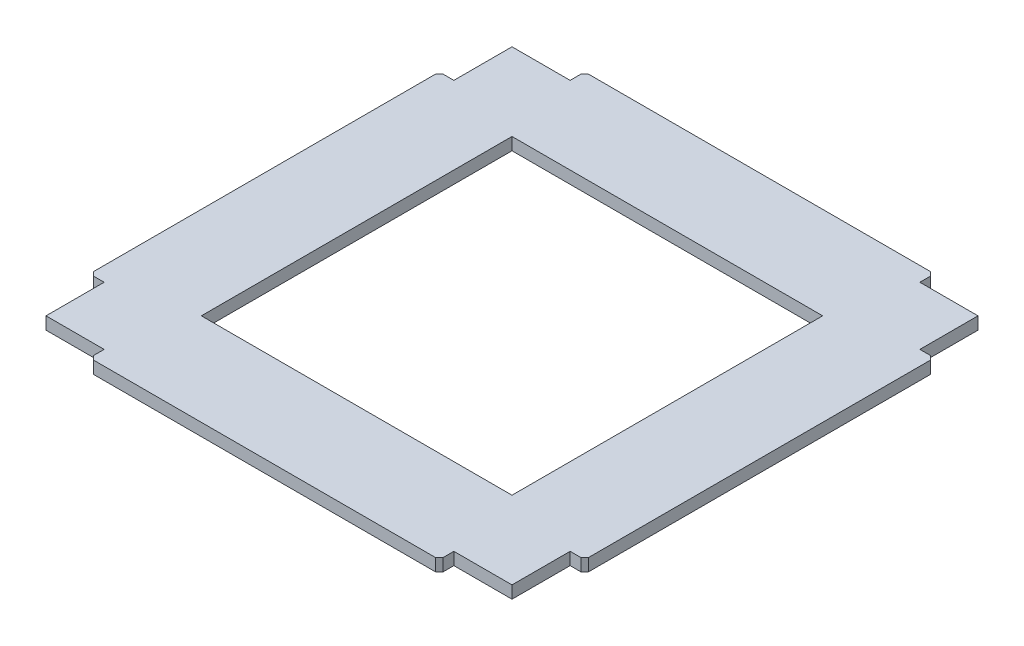
ISO-10303-21;
HEADER;
FILE_DESCRIPTION(('STEP AP214'),'2;1');
FILE_NAME('part.step','',(''),(''),'','','');
FILE_SCHEMA(('AUTOMOTIVE_DESIGN { 1 0 10303 214 1 1 1 1 }'));
ENDSEC;
DATA;
#1=APPLICATION_CONTEXT('core data for automotive mechanical design processes');
#2=APPLICATION_PROTOCOL_DEFINITION('international standard','automotive_design',2000,#1);
#3=PRODUCT_CONTEXT('',#1,'mechanical');
#4=PRODUCT('Part','Part','',(#3));
#5=PRODUCT_RELATED_PRODUCT_CATEGORY('part','',(#4));
#6=PRODUCT_DEFINITION_FORMATION('','',#4);
#7=PRODUCT_DEFINITION_CONTEXT('part definition',#1,'design');
#8=PRODUCT_DEFINITION('design','',#6,#7);
#9=PRODUCT_DEFINITION_SHAPE('','',#8);
#10=(LENGTH_UNIT() NAMED_UNIT(*) SI_UNIT(.MILLI.,.METRE.));
#11=(NAMED_UNIT(*) PLANE_ANGLE_UNIT() SI_UNIT($,.RADIAN.));
#12=(NAMED_UNIT(*) SI_UNIT($,.STERADIAN.) SOLID_ANGLE_UNIT());
#13=UNCERTAINTY_MEASURE_WITH_UNIT(LENGTH_MEASURE(1.E-05),#10,'distance_accuracy_value','');
#14=(GEOMETRIC_REPRESENTATION_CONTEXT(3) GLOBAL_UNCERTAINTY_ASSIGNED_CONTEXT((#13)) GLOBAL_UNIT_ASSIGNED_CONTEXT((#10,
#11,#12)) REPRESENTATION_CONTEXT('',''));
#15=CARTESIAN_POINT('',(0.,0.,0.));
#16=DIRECTION('',(0.,0.,1.));
#17=DIRECTION('',(1.,0.,0.));
#18=AXIS2_PLACEMENT_3D('',#15,#16,#17);
#19=CARTESIAN_POINT('',(0.,4.064,0.));
#20=DIRECTION('',(0.,-1.,0.));
#21=DIRECTION('',(0.,0.,-1.));
#22=AXIS2_PLACEMENT_3D('',#19,#20,#21);
#23=PLANE('',#22);
#24=DIRECTION('',(0.,0.,-1.));
#25=VECTOR('',#24,1.);
#26=CARTESIAN_POINT('',(757.555,4.064,57.1849999999999));
#27=LINE('',#26,#25);
#28=CARTESIAN_POINT('',(757.555,4.064,55.935));
#29=VERTEX_POINT('',#28);
#30=CARTESIAN_POINT('',(757.555,4.064,-55.9349999999995));
#31=VERTEX_POINT('',#30);
#32=EDGE_CURVE('E296',#29,#31,#27,.T.);
#33=ORIENTED_EDGE('',*,*,#32,.T.);
#34=DIRECTION('',(0.707106781186563,0.,0.707106781186532));
#35=VECTOR('',#34,1.);
#36=CARTESIAN_POINT('',(756.305,4.064,-57.1849999999994));
#37=LINE('',#36,#35);
#38=CARTESIAN_POINT('',(756.305,4.064,-57.1849999999994));
#39=VERTEX_POINT('',#38);
#40=EDGE_CURVE('E455',#31,#39,#37,.F.);
#41=ORIENTED_EDGE('',*,*,#40,.T.);
#42=DIRECTION('',(-1.,0.,0.));
#43=VECTOR('',#42,1.);
#44=CARTESIAN_POINT('',(757.555,4.064,-57.1849999999994));
#45=LINE('',#44,#43);
#46=CARTESIAN_POINT('',(752.7925,4.064,-57.1849999999994));
#47=VERTEX_POINT('',#46);
#48=EDGE_CURVE('E299',#39,#47,#45,.T.);
#49=ORIENTED_EDGE('',*,*,#48,.T.);
#50=DIRECTION('',(0.,0.,-1.));
#51=VECTOR('',#50,1.);
#52=CARTESIAN_POINT('',(752.7925,4.064,-76.2));
#53=LINE('',#52,#51);
#54=CARTESIAN_POINT('',(752.7925,4.064,-76.2));
#55=VERTEX_POINT('',#54);
#56=EDGE_CURVE('E301',#47,#55,#53,.T.);
#57=ORIENTED_EDGE('',*,*,#56,.T.);
#58=DIRECTION('',(-1.,0.,0.));
#59=VECTOR('',#58,1.);
#60=CARTESIAN_POINT('',(733.7775,4.064,-76.2));
#61=LINE('',#60,#59);
#62=CARTESIAN_POINT('',(733.7775,4.064,-76.2));
#63=VERTEX_POINT('',#62);
#64=EDGE_CURVE('E303',#55,#63,#61,.T.);
#65=ORIENTED_EDGE('',*,*,#64,.T.);
#66=DIRECTION('',(0.,0.,-1.));
#67=VECTOR('',#66,1.);
#68=CARTESIAN_POINT('',(733.7775,4.064,-80.9625));
#69=LINE('',#68,#67);
#70=CARTESIAN_POINT('',(733.7775,4.064,-79.7125000000001));
#71=VERTEX_POINT('',#70);
#72=EDGE_CURVE('E305',#63,#71,#69,.T.);
#73=ORIENTED_EDGE('',*,*,#72,.T.);
#74=DIRECTION('',(0.707106781186563,0.,0.707106781186532));
#75=VECTOR('',#74,1.);
#76=CARTESIAN_POINT('',(732.5275,4.064,-80.9625));
#77=LINE('',#76,#75);
#78=CARTESIAN_POINT('',(732.5275,4.064,-80.9625));
#79=VERTEX_POINT('',#78);
#80=EDGE_CURVE('E446',#71,#79,#77,.F.);
#81=ORIENTED_EDGE('',*,*,#80,.T.);
#82=DIRECTION('',(-1.,0.,0.));
#83=VECTOR('',#82,1.);
#84=CARTESIAN_POINT('',(619.4075,4.064,-80.9625));
#85=LINE('',#84,#83);
#86=CARTESIAN_POINT('',(620.6575,4.064,-80.9625));
#87=VERTEX_POINT('',#86);
#88=EDGE_CURVE('E308',#79,#87,#85,.T.);
#89=ORIENTED_EDGE('',*,*,#88,.T.);
#90=DIRECTION('',(0.707106781186563,0.,-0.707106781186532));
#91=VECTOR('',#90,1.);
#92=CARTESIAN_POINT('',(619.4075,4.064,-79.7125000000001));
#93=LINE('',#92,#91);
#94=CARTESIAN_POINT('',(619.4075,4.064,-79.7125000000001));
#95=VERTEX_POINT('',#94);
#96=EDGE_CURVE('E442',#87,#95,#93,.F.);
#97=ORIENTED_EDGE('',*,*,#96,.T.);
#98=DIRECTION('',(0.,0.,1.));
#99=VECTOR('',#98,1.);
#100=CARTESIAN_POINT('',(619.4075,4.064,-80.9625));
#101=LINE('',#100,#99);
#102=CARTESIAN_POINT('',(619.4075,4.064,-76.2));
#103=VERTEX_POINT('',#102);
#104=EDGE_CURVE('E311',#95,#103,#101,.T.);
#105=ORIENTED_EDGE('',*,*,#104,.T.);
#106=DIRECTION('',(-1.,0.,0.));
#107=VECTOR('',#106,1.);
#108=CARTESIAN_POINT('',(600.3925,4.064,-76.2));
#109=LINE('',#108,#107);
#110=CARTESIAN_POINT('',(600.3925,4.064,-76.2));
#111=VERTEX_POINT('',#110);
#112=EDGE_CURVE('E313',#103,#111,#109,.T.);
#113=ORIENTED_EDGE('',*,*,#112,.T.);
#114=DIRECTION('',(0.,0.,1.));
#115=VECTOR('',#114,1.);
#116=CARTESIAN_POINT('',(600.3925,4.064,-57.1849999999997));
#117=LINE('',#116,#115);
#118=CARTESIAN_POINT('',(600.3925,4.064,-57.1849999999997));
#119=VERTEX_POINT('',#118);
#120=EDGE_CURVE('E315',#111,#119,#117,.T.);
#121=ORIENTED_EDGE('',*,*,#120,.T.);
#122=DIRECTION('',(-1.,0.,0.));
#123=VECTOR('',#122,1.);
#124=CARTESIAN_POINT('',(595.63,4.064,-57.1849999999997));
#125=LINE('',#124,#123);
#126=CARTESIAN_POINT('',(596.88,4.064,-57.1849999999997));
#127=VERTEX_POINT('',#126);
#128=EDGE_CURVE('E317',#119,#127,#125,.T.);
#129=ORIENTED_EDGE('',*,*,#128,.T.);
#130=DIRECTION('',(0.707106781186548,0.,-0.707106781186548));
#131=VECTOR('',#130,1.);
#132=CARTESIAN_POINT('',(595.63,4.064,-55.9349999999998));
#133=LINE('',#132,#131);
#134=CARTESIAN_POINT('',(595.63,4.064,-55.9349999999998));
#135=VERTEX_POINT('',#134);
#136=EDGE_CURVE('E444',#127,#135,#133,.F.);
#137=ORIENTED_EDGE('',*,*,#136,.T.);
#138=DIRECTION('',(0.,0.,1.));
#139=VECTOR('',#138,1.);
#140=CARTESIAN_POINT('',(595.63,4.064,-57.1849999999997));
#141=LINE('',#140,#139);
#142=CARTESIAN_POINT('',(595.63,4.064,55.9349999999996));
#143=VERTEX_POINT('',#142);
#144=EDGE_CURVE('E320',#135,#143,#141,.T.);
#145=ORIENTED_EDGE('',*,*,#144,.T.);
#146=DIRECTION('',(-0.707106781186548,0.,-0.707106781186548));
#147=VECTOR('',#146,1.);
#148=CARTESIAN_POINT('',(596.88,4.064,57.1849999999996));
#149=LINE('',#148,#147);
#150=CARTESIAN_POINT('',(596.88,4.064,57.1849999999996));
#151=VERTEX_POINT('',#150);
#152=EDGE_CURVE('E448',#143,#151,#149,.F.);
#153=ORIENTED_EDGE('',*,*,#152,.T.);
#154=DIRECTION('',(1.,0.,0.));
#155=VECTOR('',#154,1.);
#156=CARTESIAN_POINT('',(595.63,4.064,57.1849999999996));
#157=LINE('',#156,#155);
#158=CARTESIAN_POINT('',(600.3925,4.064,57.1849999999996));
#159=VERTEX_POINT('',#158);
#160=EDGE_CURVE('E323',#151,#159,#157,.T.);
#161=ORIENTED_EDGE('',*,*,#160,.T.);
#162=DIRECTION('',(0.,0.,1.));
#163=VECTOR('',#162,1.);
#164=CARTESIAN_POINT('',(600.3925,4.064,76.2));
#165=LINE('',#164,#163);
#166=CARTESIAN_POINT('',(600.3925,4.064,76.2));
#167=VERTEX_POINT('',#166);
#168=EDGE_CURVE('E325',#159,#167,#165,.T.);
#169=ORIENTED_EDGE('',*,*,#168,.T.);
#170=DIRECTION('',(1.,0.,0.));
#171=VECTOR('',#170,1.);
#172=CARTESIAN_POINT('',(619.4075,4.064,76.2));
#173=LINE('',#172,#171);
#174=CARTESIAN_POINT('',(619.4075,4.064,76.2));
#175=VERTEX_POINT('',#174);
#176=EDGE_CURVE('E327',#167,#175,#173,.T.);
#177=ORIENTED_EDGE('',*,*,#176,.T.);
#178=DIRECTION('',(0.,0.,1.));
#179=VECTOR('',#178,1.);
#180=CARTESIAN_POINT('',(619.4075,4.064,80.9625));
#181=LINE('',#180,#179);
#182=CARTESIAN_POINT('',(619.4075,4.064,79.7125000000001));
#183=VERTEX_POINT('',#182);
#184=EDGE_CURVE('E329',#175,#183,#181,.T.);
#185=ORIENTED_EDGE('',*,*,#184,.T.);
#186=DIRECTION('',(-0.707106781186548,0.,-0.707106781186548));
#187=VECTOR('',#186,1.);
#188=CARTESIAN_POINT('',(620.6575,4.064,80.9625));
#189=LINE('',#188,#187);
#190=CARTESIAN_POINT('',(620.6575,4.064,80.9625));
#191=VERTEX_POINT('',#190);
#192=EDGE_CURVE('E450',#183,#191,#189,.F.);
#193=ORIENTED_EDGE('',*,*,#192,.T.);
#194=DIRECTION('',(1.,0.,0.));
#195=VECTOR('',#194,1.);
#196=CARTESIAN_POINT('',(619.4075,4.064,80.9625));
#197=LINE('',#196,#195);
#198=CARTESIAN_POINT('',(732.5275,4.064,80.9625));
#199=VERTEX_POINT('',#198);
#200=EDGE_CURVE('E332',#191,#199,#197,.T.);
#201=ORIENTED_EDGE('',*,*,#200,.T.);
#202=DIRECTION('',(-0.707106781186563,0.,0.707106781186532));
#203=VECTOR('',#202,1.);
#204=CARTESIAN_POINT('',(733.7775,4.064,79.7125000000001));
#205=LINE('',#204,#203);
#206=CARTESIAN_POINT('',(733.7775,4.064,79.7125000000001));
#207=VERTEX_POINT('',#206);
#208=EDGE_CURVE('E49',#199,#207,#205,.F.);
#209=ORIENTED_EDGE('',*,*,#208,.T.);
#210=DIRECTION('',(0.,0.,-1.));
#211=VECTOR('',#210,1.);
#212=CARTESIAN_POINT('',(733.7775,4.064,80.9625));
#213=LINE('',#212,#211);
#214=CARTESIAN_POINT('',(733.7775,4.064,76.2));
#215=VERTEX_POINT('',#214);
#216=EDGE_CURVE('E334',#207,#215,#213,.T.);
#217=ORIENTED_EDGE('',*,*,#216,.T.);
#218=DIRECTION('',(1.,0.,0.));
#219=VECTOR('',#218,1.);
#220=CARTESIAN_POINT('',(752.7925,4.064,76.2));
#221=LINE('',#220,#219);
#222=CARTESIAN_POINT('',(752.7925,4.064,76.2));
#223=VERTEX_POINT('',#222);
#224=EDGE_CURVE('E287',#215,#223,#221,.T.);
#225=ORIENTED_EDGE('',*,*,#224,.T.);
#226=DIRECTION('',(0.,0.,-1.));
#227=VECTOR('',#226,1.);
#228=CARTESIAN_POINT('',(752.7925,4.064,57.1849999999999));
#229=LINE('',#228,#227);
#230=CARTESIAN_POINT('',(752.7925,4.064,57.1849999999999));
#231=VERTEX_POINT('',#230);
#232=EDGE_CURVE('E290',#223,#231,#229,.T.);
#233=ORIENTED_EDGE('',*,*,#232,.T.);
#234=DIRECTION('',(1.,0.,0.));
#235=VECTOR('',#234,1.);
#236=CARTESIAN_POINT('',(757.555,4.064,57.1849999999999));
#237=LINE('',#236,#235);
#238=CARTESIAN_POINT('',(756.305,4.064,57.1849999999999));
#239=VERTEX_POINT('',#238);
#240=EDGE_CURVE('E293',#231,#239,#237,.T.);
#241=ORIENTED_EDGE('',*,*,#240,.T.);
#242=DIRECTION('',(-0.707106781186555,0.,0.70710678118654));
#243=VECTOR('',#242,1.);
#244=CARTESIAN_POINT('',(757.555,4.064,55.935));
#245=LINE('',#244,#243);
#246=EDGE_CURVE('E453',#239,#29,#245,.F.);
#247=ORIENTED_EDGE('',*,*,#246,.T.);
#248=EDGE_LOOP('',(#33,#41,#49,#57,#65,#73,#81,#89,#97,#105,#113,#121,#129,#137,#145,#153,#161,
#169,#177,#185,#193,#201,#209,#217,#225,#233,#241,#247));
#249=FACE_BOUND('',#248,.T.);
#250=DIRECTION('',(0.,0.,1.));
#251=VECTOR('',#250,1.);
#252=CARTESIAN_POINT('',(625.7925,4.064,-50.7999999999999));
#253=LINE('',#252,#251);
#254=CARTESIAN_POINT('',(625.7925,4.064,-50.7999999999999));
#255=VERTEX_POINT('',#254);
#256=CARTESIAN_POINT('',(625.7925,4.064,50.8000000000001));
#257=VERTEX_POINT('',#256);
#258=EDGE_CURVE('E246',#255,#257,#253,.T.);
#259=ORIENTED_EDGE('',*,*,#258,.F.);
#260=DIRECTION('',(-1.,0.,0.));
#261=VECTOR('',#260,1.);
#262=CARTESIAN_POINT('',(727.3925,4.064,-50.7999999999999));
#263=LINE('',#262,#261);
#264=CARTESIAN_POINT('',(727.3925,4.064,-50.7999999999999));
#265=VERTEX_POINT('',#264);
#266=EDGE_CURVE('E271',#265,#255,#263,.T.);
#267=ORIENTED_EDGE('',*,*,#266,.F.);
#268=DIRECTION('',(0.,0.,-1.));
#269=VECTOR('',#268,1.);
#270=CARTESIAN_POINT('',(727.3925,4.064,-50.7999999999999));
#271=LINE('',#270,#269);
#272=CARTESIAN_POINT('',(727.3925,4.064,50.8000000000001));
#273=VERTEX_POINT('',#272);
#274=EDGE_CURVE('E269',#273,#265,#271,.T.);
#275=ORIENTED_EDGE('',*,*,#274,.F.);
#276=DIRECTION('',(1.,0.,0.));
#277=VECTOR('',#276,1.);
#278=CARTESIAN_POINT('',(727.3925,4.064,50.8000000000001));
#279=LINE('',#278,#277);
#280=EDGE_CURVE('E256',#257,#273,#279,.T.);
#281=ORIENTED_EDGE('',*,*,#280,.F.);
#282=EDGE_LOOP('',(#259,#267,#275,#281));
#283=FACE_BOUND('',#282,.T.);
#284=ADVANCED_FACE('F34',(#249,#283),#23,.F.);
#285=CARTESIAN_POINT('',(0.,0.,0.));
#286=DIRECTION('',(0.,-1.,0.));
#287=DIRECTION('',(0.,0.,-1.));
#288=AXIS2_PLACEMENT_3D('',#285,#286,#287);
#289=PLANE('',#288);
#290=DIRECTION('',(-1.,0.,0.));
#291=VECTOR('',#290,1.);
#292=CARTESIAN_POINT('',(757.555,0.,-57.1849999999994));
#293=LINE('',#292,#291);
#294=CARTESIAN_POINT('',(756.305,0.,-57.1849999999994));
#295=VERTEX_POINT('',#294);
#296=CARTESIAN_POINT('',(752.7925,0.,-57.1849999999994));
#297=VERTEX_POINT('',#296);
#298=EDGE_CURVE('E347',#295,#297,#293,.T.);
#299=ORIENTED_EDGE('',*,*,#298,.F.);
#300=DIRECTION('',(-0.707106781186563,0.,-0.707106781186532));
#301=VECTOR('',#300,1.);
#302=CARTESIAN_POINT('',(406.744999999983,0.,-406.745000000001));
#303=LINE('',#302,#301);
#304=CARTESIAN_POINT('',(757.555,0.,-55.9349999999995));
#305=VERTEX_POINT('',#304);
#306=EDGE_CURVE('E435',#295,#305,#303,.F.);
#307=ORIENTED_EDGE('',*,*,#306,.T.);
#308=DIRECTION('',(0.,0.,-1.));
#309=VECTOR('',#308,1.);
#310=CARTESIAN_POINT('',(757.555,0.,57.1849999999999));
#311=LINE('',#310,#309);
#312=CARTESIAN_POINT('',(757.555,0.,55.935));
#313=VERTEX_POINT('',#312);
#314=EDGE_CURVE('E344',#313,#305,#311,.T.);
#315=ORIENTED_EDGE('',*,*,#314,.F.);
#316=DIRECTION('',(0.707106781186555,0.,-0.70710678118654));
#317=VECTOR('',#316,1.);
#318=CARTESIAN_POINT('',(406.744999999992,0.,406.745000000001));
#319=LINE('',#318,#317);
#320=CARTESIAN_POINT('',(756.305,0.,57.1849999999999));
#321=VERTEX_POINT('',#320);
#322=EDGE_CURVE('E433',#313,#321,#319,.F.);
#323=ORIENTED_EDGE('',*,*,#322,.T.);
#324=DIRECTION('',(1.,0.,0.));
#325=VECTOR('',#324,1.);
#326=CARTESIAN_POINT('',(757.555,0.,57.1849999999999));
#327=LINE('',#326,#325);
#328=CARTESIAN_POINT('',(752.7925,0.,57.1849999999999));
#329=VERTEX_POINT('',#328);
#330=EDGE_CURVE('E341',#329,#321,#327,.T.);
#331=ORIENTED_EDGE('',*,*,#330,.F.);
#332=DIRECTION('',(0.,0.,-1.));
#333=VECTOR('',#332,1.);
#334=CARTESIAN_POINT('',(752.7925,0.,57.1849999999999));
#335=LINE('',#334,#333);
#336=CARTESIAN_POINT('',(752.7925,0.,76.2));
#337=VERTEX_POINT('',#336);
#338=EDGE_CURVE('E339',#337,#329,#335,.T.);
#339=ORIENTED_EDGE('',*,*,#338,.F.);
#340=DIRECTION('',(1.,0.,0.));
#341=VECTOR('',#340,1.);
#342=CARTESIAN_POINT('',(752.7925,0.,76.2));
#343=LINE('',#342,#341);
#344=CARTESIAN_POINT('',(733.7775,0.,76.2));
#345=VERTEX_POINT('',#344);
#346=EDGE_CURVE('E264',#345,#337,#343,.T.);
#347=ORIENTED_EDGE('',*,*,#346,.F.);
#348=DIRECTION('',(0.,0.,-1.));
#349=VECTOR('',#348,1.);
#350=CARTESIAN_POINT('',(733.7775,0.,80.9625));
#351=LINE('',#350,#349);
#352=CARTESIAN_POINT('',(733.7775,0.,79.7125000000001));
#353=VERTEX_POINT('',#352);
#354=EDGE_CURVE('E291',#353,#345,#351,.T.);
#355=ORIENTED_EDGE('',*,*,#354,.F.);
#356=DIRECTION('',(0.707106781186563,0.,-0.707106781186532));
#357=VECTOR('',#356,1.);
#358=CARTESIAN_POINT('',(406.744999999984,0.,406.745000000002));
#359=LINE('',#358,#357);
#360=CARTESIAN_POINT('',(732.5275,0.,80.9625));
#361=VERTEX_POINT('',#360);
#362=EDGE_CURVE('E431',#353,#361,#359,.F.);
#363=ORIENTED_EDGE('',*,*,#362,.T.);
#364=DIRECTION('',(1.,0.,0.));
#365=VECTOR('',#364,1.);
#366=CARTESIAN_POINT('',(619.4075,0.,80.9625));
#367=LINE('',#366,#365);
#368=CARTESIAN_POINT('',(620.6575,0.,80.9625));
#369=VERTEX_POINT('',#368);
#370=EDGE_CURVE('E380',#369,#361,#367,.T.);
#371=ORIENTED_EDGE('',*,*,#370,.F.);
#372=DIRECTION('',(0.707106781186548,0.,0.707106781186548));
#373=VECTOR('',#372,1.);
#374=CARTESIAN_POINT('',(269.8475,0.,-269.8475));
#375=LINE('',#374,#373);
#376=CARTESIAN_POINT('',(619.4075,0.,79.7125000000001));
#377=VERTEX_POINT('',#376);
#378=EDGE_CURVE('E429',#369,#377,#375,.F.);
#379=ORIENTED_EDGE('',*,*,#378,.T.);
#380=DIRECTION('',(0.,0.,1.));
#381=VECTOR('',#380,1.);
#382=CARTESIAN_POINT('',(619.4075,0.,80.9625));
#383=LINE('',#382,#381);
#384=CARTESIAN_POINT('',(619.4075,0.,76.2));
#385=VERTEX_POINT('',#384);
#386=EDGE_CURVE('E377',#385,#377,#383,.T.);
#387=ORIENTED_EDGE('',*,*,#386,.F.);
#388=DIRECTION('',(1.,0.,0.));
#389=VECTOR('',#388,1.);
#390=CARTESIAN_POINT('',(619.4075,0.,76.2));
#391=LINE('',#390,#389);
#392=CARTESIAN_POINT('',(600.3925,0.,76.2));
#393=VERTEX_POINT('',#392);
#394=EDGE_CURVE('E375',#393,#385,#391,.T.);
#395=ORIENTED_EDGE('',*,*,#394,.F.);
#396=DIRECTION('',(0.,0.,1.));
#397=VECTOR('',#396,1.);
#398=CARTESIAN_POINT('',(600.3925,0.,76.2));
#399=LINE('',#398,#397);
#400=CARTESIAN_POINT('',(600.3925,0.,57.1849999999996));
#401=VERTEX_POINT('',#400);
#402=EDGE_CURVE('E373',#401,#393,#399,.T.);
#403=ORIENTED_EDGE('',*,*,#402,.F.);
#404=DIRECTION('',(1.,0.,0.));
#405=VECTOR('',#404,1.);
#406=CARTESIAN_POINT('',(595.63,0.,57.1849999999996));
#407=LINE('',#406,#405);
#408=CARTESIAN_POINT('',(596.88,0.,57.1849999999996));
#409=VERTEX_POINT('',#408);
#410=EDGE_CURVE('E371',#409,#401,#407,.T.);
#411=ORIENTED_EDGE('',*,*,#410,.F.);
#412=DIRECTION('',(0.707106781186548,0.,0.707106781186548));
#413=VECTOR('',#412,1.);
#414=CARTESIAN_POINT('',(269.8475,0.,-269.8475));
#415=LINE('',#414,#413);
#416=CARTESIAN_POINT('',(595.63,0.,55.9349999999996));
#417=VERTEX_POINT('',#416);
#418=EDGE_CURVE('E427',#409,#417,#415,.F.);
#419=ORIENTED_EDGE('',*,*,#418,.T.);
#420=DIRECTION('',(0.,0.,1.));
#421=VECTOR('',#420,1.);
#422=CARTESIAN_POINT('',(595.63,0.,-57.1849999999997));
#423=LINE('',#422,#421);
#424=CARTESIAN_POINT('',(595.63,0.,-55.9349999999998));
#425=VERTEX_POINT('',#424);
#426=EDGE_CURVE('E368',#425,#417,#423,.T.);
#427=ORIENTED_EDGE('',*,*,#426,.F.);
#428=DIRECTION('',(-0.707106781186548,0.,0.707106781186548));
#429=VECTOR('',#428,1.);
#430=CARTESIAN_POINT('',(269.8475,0.,269.8475));
#431=LINE('',#430,#429);
#432=CARTESIAN_POINT('',(596.88,0.,-57.1849999999997));
#433=VERTEX_POINT('',#432);
#434=EDGE_CURVE('E423',#425,#433,#431,.F.);
#435=ORIENTED_EDGE('',*,*,#434,.T.);
#436=DIRECTION('',(-1.,0.,0.));
#437=VECTOR('',#436,1.);
#438=CARTESIAN_POINT('',(595.63,0.,-57.1849999999997));
#439=LINE('',#438,#437);
#440=CARTESIAN_POINT('',(600.3925,0.,-57.1849999999997));
#441=VERTEX_POINT('',#440);
#442=EDGE_CURVE('E365',#441,#433,#439,.T.);
#443=ORIENTED_EDGE('',*,*,#442,.F.);
#444=DIRECTION('',(0.,0.,1.));
#445=VECTOR('',#444,1.);
#446=CARTESIAN_POINT('',(600.3925,0.,-57.1849999999997));
#447=LINE('',#446,#445);
#448=CARTESIAN_POINT('',(600.3925,0.,-76.2));
#449=VERTEX_POINT('',#448);
#450=EDGE_CURVE('E363',#449,#441,#447,.T.);
#451=ORIENTED_EDGE('',*,*,#450,.F.);
#452=DIRECTION('',(-1.,0.,0.));
#453=VECTOR('',#452,1.);
#454=CARTESIAN_POINT('',(600.3925,0.,-76.2));
#455=LINE('',#454,#453);
#456=CARTESIAN_POINT('',(619.4075,0.,-76.2));
#457=VERTEX_POINT('',#456);
#458=EDGE_CURVE('E361',#457,#449,#455,.T.);
#459=ORIENTED_EDGE('',*,*,#458,.F.);
#460=DIRECTION('',(0.,0.,1.));
#461=VECTOR('',#460,1.);
#462=CARTESIAN_POINT('',(619.4075,0.,-80.9625));
#463=LINE('',#462,#461);
#464=CARTESIAN_POINT('',(619.4075,0.,-79.7125000000001));
#465=VERTEX_POINT('',#464);
#466=EDGE_CURVE('E359',#465,#457,#463,.T.);
#467=ORIENTED_EDGE('',*,*,#466,.F.);
#468=DIRECTION('',(-0.707106781186563,0.,0.707106781186532));
#469=VECTOR('',#468,1.);
#470=CARTESIAN_POINT('',(269.847499999986,0.,269.847499999998));
#471=LINE('',#470,#469);
#472=CARTESIAN_POINT('',(620.6575,0.,-80.9625));
#473=VERTEX_POINT('',#472);
#474=EDGE_CURVE('E421',#465,#473,#471,.F.);
#475=ORIENTED_EDGE('',*,*,#474,.T.);
#476=DIRECTION('',(-1.,0.,0.));
#477=VECTOR('',#476,1.);
#478=CARTESIAN_POINT('',(619.4075,0.,-80.9625));
#479=LINE('',#478,#477);
#480=CARTESIAN_POINT('',(732.5275,0.,-80.9625));
#481=VERTEX_POINT('',#480);
#482=EDGE_CURVE('E356',#481,#473,#479,.T.);
#483=ORIENTED_EDGE('',*,*,#482,.F.);
#484=DIRECTION('',(-0.707106781186563,0.,-0.707106781186532));
#485=VECTOR('',#484,1.);
#486=CARTESIAN_POINT('',(406.744999999984,0.,-406.745000000002));
#487=LINE('',#486,#485);
#488=CARTESIAN_POINT('',(733.7775,0.,-79.7125000000001));
#489=VERTEX_POINT('',#488);
#490=EDGE_CURVE('E425',#481,#489,#487,.F.);
#491=ORIENTED_EDGE('',*,*,#490,.T.);
#492=DIRECTION('',(0.,0.,-1.));
#493=VECTOR('',#492,1.);
#494=CARTESIAN_POINT('',(733.7775,0.,-80.9625));
#495=LINE('',#494,#493);
#496=CARTESIAN_POINT('',(733.7775,0.,-76.2));
#497=VERTEX_POINT('',#496);
#498=EDGE_CURVE('E353',#497,#489,#495,.T.);
#499=ORIENTED_EDGE('',*,*,#498,.F.);
#500=DIRECTION('',(-1.,0.,0.));
#501=VECTOR('',#500,1.);
#502=CARTESIAN_POINT('',(733.7775,0.,-76.2));
#503=LINE('',#502,#501);
#504=CARTESIAN_POINT('',(752.7925,0.,-76.2));
#505=VERTEX_POINT('',#504);
#506=EDGE_CURVE('E351',#505,#497,#503,.T.);
#507=ORIENTED_EDGE('',*,*,#506,.F.);
#508=DIRECTION('',(0.,0.,-1.));
#509=VECTOR('',#508,1.);
#510=CARTESIAN_POINT('',(752.7925,0.,-76.2));
#511=LINE('',#510,#509);
#512=EDGE_CURVE('E349',#297,#505,#511,.T.);
#513=ORIENTED_EDGE('',*,*,#512,.F.);
#514=EDGE_LOOP('',(#299,#307,#315,#323,#331,#339,#347,#355,#363,#371,#379,#387,#395,#403,#411,
#419,#427,#435,#443,#451,#459,#467,#475,#483,#491,#499,#507,#513));
#515=FACE_BOUND('',#514,.T.);
#516=DIRECTION('',(-1.,0.,0.));
#517=VECTOR('',#516,1.);
#518=CARTESIAN_POINT('',(727.3925,0.,-50.7999999999999));
#519=LINE('',#518,#517);
#520=CARTESIAN_POINT('',(727.3925,0.,-50.7999999999999));
#521=VERTEX_POINT('',#520);
#522=CARTESIAN_POINT('',(625.7925,0.,-50.7999999999999));
#523=VERTEX_POINT('',#522);
#524=EDGE_CURVE('E257',#521,#523,#519,.T.);
#525=ORIENTED_EDGE('',*,*,#524,.T.);
#526=DIRECTION('',(0.,0.,1.));
#527=VECTOR('',#526,1.);
#528=CARTESIAN_POINT('',(625.7925,0.,-50.7999999999999));
#529=LINE('',#528,#527);
#530=CARTESIAN_POINT('',(625.7925,0.,50.8000000000001));
#531=VERTEX_POINT('',#530);
#532=EDGE_CURVE('E275',#523,#531,#529,.T.);
#533=ORIENTED_EDGE('',*,*,#532,.T.);
#534=DIRECTION('',(1.,0.,0.));
#535=VECTOR('',#534,1.);
#536=CARTESIAN_POINT('',(727.3925,0.,50.8000000000001));
#537=LINE('',#536,#535);
#538=CARTESIAN_POINT('',(727.3925,0.,50.8000000000001));
#539=VERTEX_POINT('',#538);
#540=EDGE_CURVE('E263',#531,#539,#537,.T.);
#541=ORIENTED_EDGE('',*,*,#540,.T.);
#542=DIRECTION('',(0.,0.,-1.));
#543=VECTOR('',#542,1.);
#544=CARTESIAN_POINT('',(727.3925,0.,-50.7999999999999));
#545=LINE('',#544,#543);
#546=EDGE_CURVE('E278',#539,#521,#545,.T.);
#547=ORIENTED_EDGE('',*,*,#546,.T.);
#548=EDGE_LOOP('',(#525,#533,#541,#547));
#549=FACE_BOUND('',#548,.T.);
#550=ADVANCED_FACE('F500',(#515,#549),#289,.T.);
#551=CARTESIAN_POINT('',(752.7925,4.064,76.2));
#552=DIRECTION('',(0.,0.,-1.));
#553=DIRECTION('',(-1.,0.,0.));
#554=AXIS2_PLACEMENT_3D('',#551,#552,#553);
#555=PLANE('',#554);
#556=ORIENTED_EDGE('',*,*,#346,.T.);
#557=DIRECTION('',(0.,-1.,0.));
#558=VECTOR('',#557,1.);
#559=CARTESIAN_POINT('',(752.7925,4.064,76.2));
#560=LINE('',#559,#558);
#561=EDGE_CURVE('E415',#223,#337,#560,.T.);
#562=ORIENTED_EDGE('',*,*,#561,.F.);
#563=ORIENTED_EDGE('',*,*,#224,.F.);
#564=DIRECTION('',(0.,-1.,0.));
#565=VECTOR('',#564,1.);
#566=CARTESIAN_POINT('',(733.7775,4.064,76.2));
#567=LINE('',#566,#565);
#568=EDGE_CURVE('E336',#215,#345,#567,.T.);
#569=ORIENTED_EDGE('',*,*,#568,.T.);
#570=EDGE_LOOP('',(#556,#562,#563,#569));
#571=FACE_BOUND('',#570,.T.);
#572=ADVANCED_FACE('F544',(#571),#555,.F.);
#573=CARTESIAN_POINT('',(752.7925,4.064,57.1849999999999));
#574=DIRECTION('',(-1.,0.,0.));
#575=DIRECTION('',(0.,0.,1.));
#576=AXIS2_PLACEMENT_3D('',#573,#574,#575);
#577=PLANE('',#576);
#578=ORIENTED_EDGE('',*,*,#338,.T.);
#579=DIRECTION('',(0.,-1.,0.));
#580=VECTOR('',#579,1.);
#581=CARTESIAN_POINT('',(752.7925,4.064,57.1849999999999));
#582=LINE('',#581,#580);
#583=EDGE_CURVE('E412',#231,#329,#582,.T.);
#584=ORIENTED_EDGE('',*,*,#583,.F.);
#585=ORIENTED_EDGE('',*,*,#232,.F.);
#586=ORIENTED_EDGE('',*,*,#561,.T.);
#587=EDGE_LOOP('',(#578,#584,#585,#586));
#588=FACE_BOUND('',#587,.T.);
#589=ADVANCED_FACE('F546',(#588),#577,.F.);
#590=CARTESIAN_POINT('',(757.555,4.064,57.1849999999999));
#591=DIRECTION('',(0.,0.,-1.));
#592=DIRECTION('',(-1.,0.,0.));
#593=AXIS2_PLACEMENT_3D('',#590,#591,#592);
#594=PLANE('',#593);
#595=ORIENTED_EDGE('',*,*,#330,.T.);
#596=DIRECTION('',(0.,1.,0.));
#597=VECTOR('',#596,1.);
#598=CARTESIAN_POINT('',(756.305,4.064,57.1849999999999));
#599=LINE('',#598,#597);
#600=EDGE_CURVE('E457',#321,#239,#599,.T.);
#601=ORIENTED_EDGE('',*,*,#600,.T.);
#602=ORIENTED_EDGE('',*,*,#240,.F.);
#603=ORIENTED_EDGE('',*,*,#583,.T.);
#604=EDGE_LOOP('',(#595,#601,#602,#603));
#605=FACE_BOUND('',#604,.T.);
#606=ADVANCED_FACE('F550',(#605),#594,.F.);
#607=CARTESIAN_POINT('',(757.555,4.064,57.1849999999999));
#608=DIRECTION('',(-1.,0.,0.));
#609=DIRECTION('',(0.,0.,1.));
#610=AXIS2_PLACEMENT_3D('',#607,#608,#609);
#611=PLANE('',#610);
#612=ORIENTED_EDGE('',*,*,#314,.T.);
#613=DIRECTION('',(0.,1.,0.));
#614=VECTOR('',#613,1.);
#615=CARTESIAN_POINT('',(757.555,4.064,-55.9349999999995));
#616=LINE('',#615,#614);
#617=EDGE_CURVE('E440',#305,#31,#616,.T.);
#618=ORIENTED_EDGE('',*,*,#617,.T.);
#619=ORIENTED_EDGE('',*,*,#32,.F.);
#620=DIRECTION('',(0.,-1.,0.));
#621=VECTOR('',#620,1.);
#622=CARTESIAN_POINT('',(757.555,4.064,55.935));
#623=LINE('',#622,#621);
#624=EDGE_CURVE('E437',#29,#313,#623,.T.);
#625=ORIENTED_EDGE('',*,*,#624,.T.);
#626=EDGE_LOOP('',(#612,#618,#619,#625));
#627=FACE_BOUND('',#626,.T.);
#628=ADVANCED_FACE('F559',(#627),#611,.F.);
#629=CARTESIAN_POINT('',(757.555,4.064,-57.1849999999994));
#630=DIRECTION('',(0.,0.,1.));
#631=DIRECTION('',(1.,0.,0.));
#632=AXIS2_PLACEMENT_3D('',#629,#630,#631);
#633=PLANE('',#632);
#634=ORIENTED_EDGE('',*,*,#48,.F.);
#635=DIRECTION('',(0.,-1.,0.));
#636=VECTOR('',#635,1.);
#637=CARTESIAN_POINT('',(756.305,4.064,-57.1849999999994));
#638=LINE('',#637,#636);
#639=EDGE_CURVE('E418',#39,#295,#638,.T.);
#640=ORIENTED_EDGE('',*,*,#639,.T.);
#641=ORIENTED_EDGE('',*,*,#298,.T.);
#642=DIRECTION('',(0.,-1.,0.));
#643=VECTOR('',#642,1.);
#644=CARTESIAN_POINT('',(752.7925,4.064,-57.1849999999994));
#645=LINE('',#644,#643);
#646=EDGE_CURVE('E409',#47,#297,#645,.T.);
#647=ORIENTED_EDGE('',*,*,#646,.F.);
#648=EDGE_LOOP('',(#634,#640,#641,#647));
#649=FACE_BOUND('',#648,.T.);
#650=ADVANCED_FACE('F568',(#649),#633,.F.);
#651=CARTESIAN_POINT('',(752.7925,4.064,-76.2));
#652=DIRECTION('',(-1.,0.,0.));
#653=DIRECTION('',(0.,0.,1.));
#654=AXIS2_PLACEMENT_3D('',#651,#652,#653);
#655=PLANE('',#654);
#656=ORIENTED_EDGE('',*,*,#512,.T.);
#657=DIRECTION('',(0.,-1.,0.));
#658=VECTOR('',#657,1.);
#659=CARTESIAN_POINT('',(752.7925,4.064,-76.2));
#660=LINE('',#659,#658);
#661=EDGE_CURVE('E406',#55,#505,#660,.T.);
#662=ORIENTED_EDGE('',*,*,#661,.F.);
#663=ORIENTED_EDGE('',*,*,#56,.F.);
#664=ORIENTED_EDGE('',*,*,#646,.T.);
#665=EDGE_LOOP('',(#656,#662,#663,#664));
#666=FACE_BOUND('',#665,.T.);
#667=ADVANCED_FACE('F575',(#666),#655,.F.);
#668=CARTESIAN_POINT('',(733.7775,4.064,-76.2));
#669=DIRECTION('',(0.,0.,1.));
#670=DIRECTION('',(1.,0.,0.));
#671=AXIS2_PLACEMENT_3D('',#668,#669,#670);
#672=PLANE('',#671);
#673=ORIENTED_EDGE('',*,*,#506,.T.);
#674=DIRECTION('',(0.,-1.,0.));
#675=VECTOR('',#674,1.);
#676=CARTESIAN_POINT('',(733.7775,4.064,-76.2));
#677=LINE('',#676,#675);
#678=EDGE_CURVE('E403',#63,#497,#677,.T.);
#679=ORIENTED_EDGE('',*,*,#678,.F.);
#680=ORIENTED_EDGE('',*,*,#64,.F.);
#681=ORIENTED_EDGE('',*,*,#661,.T.);
#682=EDGE_LOOP('',(#673,#679,#680,#681));
#683=FACE_BOUND('',#682,.T.);
#684=ADVANCED_FACE('F578',(#683),#672,.F.);
#685=CARTESIAN_POINT('',(733.7775,4.064,-80.9625));
#686=DIRECTION('',(-1.,0.,0.));
#687=DIRECTION('',(0.,0.,1.));
#688=AXIS2_PLACEMENT_3D('',#685,#686,#687);
#689=PLANE('',#688);
#690=ORIENTED_EDGE('',*,*,#498,.T.);
#691=DIRECTION('',(0.,1.,0.));
#692=VECTOR('',#691,1.);
#693=CARTESIAN_POINT('',(733.7775,4.064,-79.7125000000001));
#694=LINE('',#693,#692);
#695=EDGE_CURVE('E481',#489,#71,#694,.T.);
#696=ORIENTED_EDGE('',*,*,#695,.T.);
#697=ORIENTED_EDGE('',*,*,#72,.F.);
#698=ORIENTED_EDGE('',*,*,#678,.T.);
#699=EDGE_LOOP('',(#690,#696,#697,#698));
#700=FACE_BOUND('',#699,.T.);
#701=ADVANCED_FACE('F582',(#700),#689,.F.);
#702=CARTESIAN_POINT('',(619.4075,4.064,-80.9625));
#703=DIRECTION('',(0.,0.,1.));
#704=DIRECTION('',(1.,0.,0.));
#705=AXIS2_PLACEMENT_3D('',#702,#703,#704);
#706=PLANE('',#705);
#707=ORIENTED_EDGE('',*,*,#88,.F.);
#708=DIRECTION('',(0.,-1.,0.));
#709=VECTOR('',#708,1.);
#710=CARTESIAN_POINT('',(732.5275,4.064,-80.9625));
#711=LINE('',#710,#709);
#712=EDGE_CURVE('E478',#79,#481,#711,.T.);
#713=ORIENTED_EDGE('',*,*,#712,.T.);
#714=ORIENTED_EDGE('',*,*,#482,.T.);
#715=DIRECTION('',(0.,1.,0.));
#716=VECTOR('',#715,1.);
#717=CARTESIAN_POINT('',(620.6575,4.064,-80.9625));
#718=LINE('',#717,#716);
#719=EDGE_CURVE('E476',#473,#87,#718,.T.);
#720=ORIENTED_EDGE('',*,*,#719,.T.);
#721=EDGE_LOOP('',(#707,#713,#714,#720));
#722=FACE_BOUND('',#721,.T.);
#723=ADVANCED_FACE('F591',(#722),#706,.F.);
#724=CARTESIAN_POINT('',(619.4075,4.064,-80.9625));
#725=DIRECTION('',(1.,0.,0.));
#726=DIRECTION('',(0.,0.,-1.));
#727=AXIS2_PLACEMENT_3D('',#724,#725,#726);
#728=PLANE('',#727);
#729=ORIENTED_EDGE('',*,*,#104,.F.);
#730=DIRECTION('',(0.,-1.,0.));
#731=VECTOR('',#730,1.);
#732=CARTESIAN_POINT('',(619.4075,4.064,-79.7125000000001));
#733=LINE('',#732,#731);
#734=EDGE_CURVE('E11',#95,#465,#733,.T.);
#735=ORIENTED_EDGE('',*,*,#734,.T.);
#736=ORIENTED_EDGE('',*,*,#466,.T.);
#737=DIRECTION('',(0.,-1.,0.));
#738=VECTOR('',#737,1.);
#739=CARTESIAN_POINT('',(619.4075,4.064,-76.2));
#740=LINE('',#739,#738);
#741=EDGE_CURVE('E400',#103,#457,#740,.T.);
#742=ORIENTED_EDGE('',*,*,#741,.F.);
#743=EDGE_LOOP('',(#729,#735,#736,#742));
#744=FACE_BOUND('',#743,.T.);
#745=ADVANCED_FACE('F600',(#744),#728,.F.);
#746=CARTESIAN_POINT('',(600.3925,4.064,-76.2));
#747=DIRECTION('',(0.,0.,1.));
#748=DIRECTION('',(1.,0.,0.));
#749=AXIS2_PLACEMENT_3D('',#746,#747,#748);
#750=PLANE('',#749);
#751=ORIENTED_EDGE('',*,*,#458,.T.);
#752=DIRECTION('',(0.,-1.,0.));
#753=VECTOR('',#752,1.);
#754=CARTESIAN_POINT('',(600.3925,4.064,-76.2));
#755=LINE('',#754,#753);
#756=EDGE_CURVE('E397',#111,#449,#755,.T.);
#757=ORIENTED_EDGE('',*,*,#756,.F.);
#758=ORIENTED_EDGE('',*,*,#112,.F.);
#759=ORIENTED_EDGE('',*,*,#741,.T.);
#760=EDGE_LOOP('',(#751,#757,#758,#759));
#761=FACE_BOUND('',#760,.T.);
#762=ADVANCED_FACE('F605',(#761),#750,.F.);
#763=CARTESIAN_POINT('',(600.3925,4.064,-57.1849999999997));
#764=DIRECTION('',(1.,0.,0.));
#765=DIRECTION('',(0.,0.,-1.));
#766=AXIS2_PLACEMENT_3D('',#763,#764,#765);
#767=PLANE('',#766);
#768=ORIENTED_EDGE('',*,*,#450,.T.);
#769=DIRECTION('',(0.,-1.,0.));
#770=VECTOR('',#769,1.);
#771=CARTESIAN_POINT('',(600.3925,4.064,-57.1849999999997));
#772=LINE('',#771,#770);
#773=EDGE_CURVE('E394',#119,#441,#772,.T.);
#774=ORIENTED_EDGE('',*,*,#773,.F.);
#775=ORIENTED_EDGE('',*,*,#120,.F.);
#776=ORIENTED_EDGE('',*,*,#756,.T.);
#777=EDGE_LOOP('',(#768,#774,#775,#776));
#778=FACE_BOUND('',#777,.T.);
#779=ADVANCED_FACE('F608',(#778),#767,.F.);
#780=CARTESIAN_POINT('',(595.63,4.064,-57.1849999999997));
#781=DIRECTION('',(0.,0.,1.));
#782=DIRECTION('',(1.,0.,0.));
#783=AXIS2_PLACEMENT_3D('',#780,#781,#782);
#784=PLANE('',#783);
#785=ORIENTED_EDGE('',*,*,#442,.T.);
#786=DIRECTION('',(0.,1.,0.));
#787=VECTOR('',#786,1.);
#788=CARTESIAN_POINT('',(596.88,4.064,-57.1849999999997));
#789=LINE('',#788,#787);
#790=EDGE_CURVE('E42',#433,#127,#789,.T.);
#791=ORIENTED_EDGE('',*,*,#790,.T.);
#792=ORIENTED_EDGE('',*,*,#128,.F.);
#793=ORIENTED_EDGE('',*,*,#773,.T.);
#794=EDGE_LOOP('',(#785,#791,#792,#793));
#795=FACE_BOUND('',#794,.T.);
#796=ADVANCED_FACE('F485',(#795),#784,.F.);
#797=CARTESIAN_POINT('',(595.63,4.064,-57.1849999999997));
#798=DIRECTION('',(1.,0.,0.));
#799=DIRECTION('',(0.,0.,-1.));
#800=AXIS2_PLACEMENT_3D('',#797,#798,#799);
#801=PLANE('',#800);
#802=ORIENTED_EDGE('',*,*,#426,.T.);
#803=DIRECTION('',(0.,1.,0.));
#804=VECTOR('',#803,1.);
#805=CARTESIAN_POINT('',(595.63,4.064,55.9349999999996));
#806=LINE('',#805,#804);
#807=EDGE_CURVE('E474',#417,#143,#806,.T.);
#808=ORIENTED_EDGE('',*,*,#807,.T.);
#809=ORIENTED_EDGE('',*,*,#144,.F.);
#810=DIRECTION('',(0.,-1.,0.));
#811=VECTOR('',#810,1.);
#812=CARTESIAN_POINT('',(595.63,4.064,-55.9349999999998));
#813=LINE('',#812,#811);
#814=EDGE_CURVE('E471',#135,#425,#813,.T.);
#815=ORIENTED_EDGE('',*,*,#814,.T.);
#816=EDGE_LOOP('',(#802,#808,#809,#815));
#817=FACE_BOUND('',#816,.T.);
#818=ADVANCED_FACE('F496',(#817),#801,.F.);
#819=CARTESIAN_POINT('',(595.63,4.064,57.1849999999996));
#820=DIRECTION('',(0.,0.,-1.));
#821=DIRECTION('',(-1.,0.,0.));
#822=AXIS2_PLACEMENT_3D('',#819,#820,#821);
#823=PLANE('',#822);
#824=ORIENTED_EDGE('',*,*,#160,.F.);
#825=DIRECTION('',(0.,-1.,0.));
#826=VECTOR('',#825,1.);
#827=CARTESIAN_POINT('',(596.88,4.064,57.1849999999996));
#828=LINE('',#827,#826);
#829=EDGE_CURVE('E468',#151,#409,#828,.T.);
#830=ORIENTED_EDGE('',*,*,#829,.T.);
#831=ORIENTED_EDGE('',*,*,#410,.T.);
#832=DIRECTION('',(0.,-1.,0.));
#833=VECTOR('',#832,1.);
#834=CARTESIAN_POINT('',(600.3925,4.064,57.1849999999996));
#835=LINE('',#834,#833);
#836=EDGE_CURVE('E391',#159,#401,#835,.T.);
#837=ORIENTED_EDGE('',*,*,#836,.F.);
#838=EDGE_LOOP('',(#824,#830,#831,#837));
#839=FACE_BOUND('',#838,.T.);
#840=ADVANCED_FACE('F510',(#839),#823,.F.);
#841=CARTESIAN_POINT('',(600.3925,4.064,76.2));
#842=DIRECTION('',(1.,0.,0.));
#843=DIRECTION('',(0.,0.,-1.));
#844=AXIS2_PLACEMENT_3D('',#841,#842,#843);
#845=PLANE('',#844);
#846=ORIENTED_EDGE('',*,*,#402,.T.);
#847=DIRECTION('',(0.,-1.,0.));
#848=VECTOR('',#847,1.);
#849=CARTESIAN_POINT('',(600.3925,4.064,76.2));
#850=LINE('',#849,#848);
#851=EDGE_CURVE('E388',#167,#393,#850,.T.);
#852=ORIENTED_EDGE('',*,*,#851,.F.);
#853=ORIENTED_EDGE('',*,*,#168,.F.);
#854=ORIENTED_EDGE('',*,*,#836,.T.);
#855=EDGE_LOOP('',(#846,#852,#853,#854));
#856=FACE_BOUND('',#855,.T.);
#857=ADVANCED_FACE('F517',(#856),#845,.F.);
#858=CARTESIAN_POINT('',(619.4075,4.064,76.2));
#859=DIRECTION('',(0.,0.,-1.));
#860=DIRECTION('',(-1.,0.,0.));
#861=AXIS2_PLACEMENT_3D('',#858,#859,#860);
#862=PLANE('',#861);
#863=ORIENTED_EDGE('',*,*,#394,.T.);
#864=DIRECTION('',(0.,-1.,0.));
#865=VECTOR('',#864,1.);
#866=CARTESIAN_POINT('',(619.4075,4.064,76.2));
#867=LINE('',#866,#865);
#868=EDGE_CURVE('E385',#175,#385,#867,.T.);
#869=ORIENTED_EDGE('',*,*,#868,.F.);
#870=ORIENTED_EDGE('',*,*,#176,.F.);
#871=ORIENTED_EDGE('',*,*,#851,.T.);
#872=EDGE_LOOP('',(#863,#869,#870,#871));
#873=FACE_BOUND('',#872,.T.);
#874=ADVANCED_FACE('F520',(#873),#862,.F.);
#875=CARTESIAN_POINT('',(619.4075,4.064,80.9625));
#876=DIRECTION('',(1.,0.,0.));
#877=DIRECTION('',(0.,0.,-1.));
#878=AXIS2_PLACEMENT_3D('',#875,#876,#877);
#879=PLANE('',#878);
#880=ORIENTED_EDGE('',*,*,#386,.T.);
#881=DIRECTION('',(0.,1.,0.));
#882=VECTOR('',#881,1.);
#883=CARTESIAN_POINT('',(619.4075,4.064,79.7125000000001));
#884=LINE('',#883,#882);
#885=EDGE_CURVE('E466',#377,#183,#884,.T.);
#886=ORIENTED_EDGE('',*,*,#885,.T.);
#887=ORIENTED_EDGE('',*,*,#184,.F.);
#888=ORIENTED_EDGE('',*,*,#868,.T.);
#889=EDGE_LOOP('',(#880,#886,#887,#888));
#890=FACE_BOUND('',#889,.T.);
#891=ADVANCED_FACE('F524',(#890),#879,.F.);
#892=CARTESIAN_POINT('',(619.4075,4.064,80.9625));
#893=DIRECTION('',(0.,0.,-1.));
#894=DIRECTION('',(-1.,0.,0.));
#895=AXIS2_PLACEMENT_3D('',#892,#893,#894);
#896=PLANE('',#895);
#897=ORIENTED_EDGE('',*,*,#370,.T.);
#898=DIRECTION('',(0.,1.,0.));
#899=VECTOR('',#898,1.);
#900=CARTESIAN_POINT('',(732.5275,4.064,80.9625));
#901=LINE('',#900,#899);
#902=EDGE_CURVE('E57',#361,#199,#901,.T.);
#903=ORIENTED_EDGE('',*,*,#902,.T.);
#904=ORIENTED_EDGE('',*,*,#200,.F.);
#905=DIRECTION('',(0.,-1.,0.));
#906=VECTOR('',#905,1.);
#907=CARTESIAN_POINT('',(620.6575,4.064,80.9625));
#908=LINE('',#907,#906);
#909=EDGE_CURVE('E462',#191,#369,#908,.T.);
#910=ORIENTED_EDGE('',*,*,#909,.T.);
#911=EDGE_LOOP('',(#897,#903,#904,#910));
#912=FACE_BOUND('',#911,.T.);
#913=ADVANCED_FACE('F531',(#912),#896,.F.);
#914=CARTESIAN_POINT('',(733.7775,4.064,80.9625));
#915=DIRECTION('',(-1.,0.,0.));
#916=DIRECTION('',(0.,0.,1.));
#917=AXIS2_PLACEMENT_3D('',#914,#915,#916);
#918=PLANE('',#917);
#919=ORIENTED_EDGE('',*,*,#216,.F.);
#920=DIRECTION('',(0.,-1.,0.));
#921=VECTOR('',#920,1.);
#922=CARTESIAN_POINT('',(733.7775,4.064,79.7125000000001));
#923=LINE('',#922,#921);
#924=EDGE_CURVE('E459',#207,#353,#923,.T.);
#925=ORIENTED_EDGE('',*,*,#924,.T.);
#926=ORIENTED_EDGE('',*,*,#354,.T.);
#927=ORIENTED_EDGE('',*,*,#568,.F.);
#928=EDGE_LOOP('',(#919,#925,#926,#927));
#929=FACE_BOUND('',#928,.T.);
#930=ADVANCED_FACE('F538',(#929),#918,.F.);
#931=CARTESIAN_POINT('',(625.7925,4.064,-50.7999999999999));
#932=DIRECTION('',(1.,0.,0.));
#933=DIRECTION('',(0.,0.,-1.));
#934=AXIS2_PLACEMENT_3D('',#931,#932,#933);
#935=PLANE('',#934);
#936=ORIENTED_EDGE('',*,*,#532,.F.);
#937=DIRECTION('',(0.,-1.,0.));
#938=VECTOR('',#937,1.);
#939=CARTESIAN_POINT('',(625.7925,4.064,-50.7999999999999));
#940=LINE('',#939,#938);
#941=EDGE_CURVE('E252',#255,#523,#940,.T.);
#942=ORIENTED_EDGE('',*,*,#941,.F.);
#943=ORIENTED_EDGE('',*,*,#258,.T.);
#944=DIRECTION('',(0.,-1.,0.));
#945=VECTOR('',#944,1.);
#946=CARTESIAN_POINT('',(625.7925,4.064,50.8000000000001));
#947=LINE('',#946,#945);
#948=EDGE_CURVE('E249',#257,#531,#947,.T.);
#949=ORIENTED_EDGE('',*,*,#948,.T.);
#950=EDGE_LOOP('',(#936,#942,#943,#949));
#951=FACE_BOUND('',#950,.T.);
#952=ADVANCED_FACE('F248',(#951),#935,.T.);
#953=CARTESIAN_POINT('',(727.3925,4.064,50.8000000000001));
#954=DIRECTION('',(0.,0.,-1.));
#955=DIRECTION('',(-1.,0.,0.));
#956=AXIS2_PLACEMENT_3D('',#953,#954,#955);
#957=PLANE('',#956);
#958=ORIENTED_EDGE('',*,*,#540,.F.);
#959=ORIENTED_EDGE('',*,*,#948,.F.);
#960=ORIENTED_EDGE('',*,*,#280,.T.);
#961=DIRECTION('',(0.,-1.,0.));
#962=VECTOR('',#961,1.);
#963=CARTESIAN_POINT('',(727.3925,4.064,50.8000000000001));
#964=LINE('',#963,#962);
#965=EDGE_CURVE('E265',#273,#539,#964,.T.);
#966=ORIENTED_EDGE('',*,*,#965,.T.);
#967=EDGE_LOOP('',(#958,#959,#960,#966));
#968=FACE_BOUND('',#967,.T.);
#969=ADVANCED_FACE('F260',(#968),#957,.T.);
#970=CARTESIAN_POINT('',(727.3925,4.064,-50.7999999999999));
#971=DIRECTION('',(-1.,0.,0.));
#972=DIRECTION('',(0.,0.,1.));
#973=AXIS2_PLACEMENT_3D('',#970,#971,#972);
#974=PLANE('',#973);
#975=ORIENTED_EDGE('',*,*,#546,.F.);
#976=ORIENTED_EDGE('',*,*,#965,.F.);
#977=ORIENTED_EDGE('',*,*,#274,.T.);
#978=DIRECTION('',(0.,-1.,0.));
#979=VECTOR('',#978,1.);
#980=CARTESIAN_POINT('',(727.3925,4.064,-50.7999999999999));
#981=LINE('',#980,#979);
#982=EDGE_CURVE('E284',#265,#521,#981,.T.);
#983=ORIENTED_EDGE('',*,*,#982,.T.);
#984=EDGE_LOOP('',(#975,#976,#977,#983));
#985=FACE_BOUND('',#984,.T.);
#986=ADVANCED_FACE('F686',(#985),#974,.T.);
#987=CARTESIAN_POINT('',(727.3925,4.064,-50.7999999999999));
#988=DIRECTION('',(0.,0.,1.));
#989=DIRECTION('',(1.,0.,0.));
#990=AXIS2_PLACEMENT_3D('',#987,#988,#989);
#991=PLANE('',#990);
#992=ORIENTED_EDGE('',*,*,#524,.F.);
#993=ORIENTED_EDGE('',*,*,#982,.F.);
#994=ORIENTED_EDGE('',*,*,#266,.T.);
#995=ORIENTED_EDGE('',*,*,#941,.T.);
#996=EDGE_LOOP('',(#992,#993,#994,#995));
#997=FACE_BOUND('',#996,.T.);
#998=ADVANCED_FACE('F693',(#997),#991,.T.);
#999=CARTESIAN_POINT('',(756.305,4.064,-57.1849999999994));
#1000=DIRECTION('',(-0.707106781186532,0.,0.707106781186563));
#1001=DIRECTION('',(0.,-1.,0.));
#1002=AXIS2_PLACEMENT_3D('',#999,#1000,#1001);
#1003=PLANE('',#1002);
#1004=ORIENTED_EDGE('',*,*,#40,.F.);
#1005=ORIENTED_EDGE('',*,*,#617,.F.);
#1006=ORIENTED_EDGE('',*,*,#306,.F.);
#1007=ORIENTED_EDGE('',*,*,#639,.F.);
#1008=EDGE_LOOP('',(#1004,#1005,#1006,#1007));
#1009=FACE_BOUND('',#1008,.T.);
#1010=ADVANCED_FACE('F565',(#1009),#1003,.F.);
#1011=CARTESIAN_POINT('',(757.555,4.064,55.935));
#1012=DIRECTION('',(-0.70710678118654,0.,-0.707106781186555));
#1013=DIRECTION('',(0.,-1.,0.));
#1014=AXIS2_PLACEMENT_3D('',#1011,#1012,#1013);
#1015=PLANE('',#1014);
#1016=ORIENTED_EDGE('',*,*,#246,.F.);
#1017=ORIENTED_EDGE('',*,*,#600,.F.);
#1018=ORIENTED_EDGE('',*,*,#322,.F.);
#1019=ORIENTED_EDGE('',*,*,#624,.F.);
#1020=EDGE_LOOP('',(#1016,#1017,#1018,#1019));
#1021=FACE_BOUND('',#1020,.T.);
#1022=ADVANCED_FACE('F556',(#1021),#1015,.F.);
#1023=CARTESIAN_POINT('',(733.7775,4.064,79.7125000000001));
#1024=DIRECTION('',(-0.707106781186532,0.,-0.707106781186563));
#1025=DIRECTION('',(0.,-1.,0.));
#1026=AXIS2_PLACEMENT_3D('',#1023,#1024,#1025);
#1027=PLANE('',#1026);
#1028=ORIENTED_EDGE('',*,*,#208,.F.);
#1029=ORIENTED_EDGE('',*,*,#902,.F.);
#1030=ORIENTED_EDGE('',*,*,#362,.F.);
#1031=ORIENTED_EDGE('',*,*,#924,.F.);
#1032=EDGE_LOOP('',(#1028,#1029,#1030,#1031));
#1033=FACE_BOUND('',#1032,.T.);
#1034=ADVANCED_FACE('F536',(#1033),#1027,.F.);
#1035=CARTESIAN_POINT('',(620.6575,4.064,80.9625));
#1036=DIRECTION('',(0.707106781186548,0.,-0.707106781186548));
#1037=DIRECTION('',(0.,-1.,0.));
#1038=AXIS2_PLACEMENT_3D('',#1035,#1036,#1037);
#1039=PLANE('',#1038);
#1040=ORIENTED_EDGE('',*,*,#192,.F.);
#1041=ORIENTED_EDGE('',*,*,#885,.F.);
#1042=ORIENTED_EDGE('',*,*,#378,.F.);
#1043=ORIENTED_EDGE('',*,*,#909,.F.);
#1044=EDGE_LOOP('',(#1040,#1041,#1042,#1043));
#1045=FACE_BOUND('',#1044,.T.);
#1046=ADVANCED_FACE('F529',(#1045),#1039,.F.);
#1047=CARTESIAN_POINT('',(596.88,4.064,57.1849999999996));
#1048=DIRECTION('',(0.707106781186548,0.,-0.707106781186548));
#1049=DIRECTION('',(0.,-1.,0.));
#1050=AXIS2_PLACEMENT_3D('',#1047,#1048,#1049);
#1051=PLANE('',#1050);
#1052=ORIENTED_EDGE('',*,*,#152,.F.);
#1053=ORIENTED_EDGE('',*,*,#807,.F.);
#1054=ORIENTED_EDGE('',*,*,#418,.F.);
#1055=ORIENTED_EDGE('',*,*,#829,.F.);
#1056=EDGE_LOOP('',(#1052,#1053,#1054,#1055));
#1057=FACE_BOUND('',#1056,.T.);
#1058=ADVANCED_FACE('F507',(#1057),#1051,.F.);
#1059=CARTESIAN_POINT('',(732.5275,4.064,-80.9625));
#1060=DIRECTION('',(-0.707106781186532,0.,0.707106781186563));
#1061=DIRECTION('',(0.,-1.,0.));
#1062=AXIS2_PLACEMENT_3D('',#1059,#1060,#1061);
#1063=PLANE('',#1062);
#1064=ORIENTED_EDGE('',*,*,#80,.F.);
#1065=ORIENTED_EDGE('',*,*,#695,.F.);
#1066=ORIENTED_EDGE('',*,*,#490,.F.);
#1067=ORIENTED_EDGE('',*,*,#712,.F.);
#1068=EDGE_LOOP('',(#1064,#1065,#1066,#1067));
#1069=FACE_BOUND('',#1068,.T.);
#1070=ADVANCED_FACE('F588',(#1069),#1063,.F.);
#1071=CARTESIAN_POINT('',(595.63,4.064,-55.9349999999998));
#1072=DIRECTION('',(0.707106781186548,0.,0.707106781186548));
#1073=DIRECTION('',(0.,-1.,0.));
#1074=AXIS2_PLACEMENT_3D('',#1071,#1072,#1073);
#1075=PLANE('',#1074);
#1076=ORIENTED_EDGE('',*,*,#136,.F.);
#1077=ORIENTED_EDGE('',*,*,#790,.F.);
#1078=ORIENTED_EDGE('',*,*,#434,.F.);
#1079=ORIENTED_EDGE('',*,*,#814,.F.);
#1080=EDGE_LOOP('',(#1076,#1077,#1078,#1079));
#1081=FACE_BOUND('',#1080,.T.);
#1082=ADVANCED_FACE('F493',(#1081),#1075,.F.);
#1083=CARTESIAN_POINT('',(619.4075,4.064,-79.7125000000001));
#1084=DIRECTION('',(0.707106781186532,0.,0.707106781186563));
#1085=DIRECTION('',(0.,-1.,0.));
#1086=AXIS2_PLACEMENT_3D('',#1083,#1084,#1085);
#1087=PLANE('',#1086);
#1088=ORIENTED_EDGE('',*,*,#96,.F.);
#1089=ORIENTED_EDGE('',*,*,#719,.F.);
#1090=ORIENTED_EDGE('',*,*,#474,.F.);
#1091=ORIENTED_EDGE('',*,*,#734,.F.);
#1092=EDGE_LOOP('',(#1088,#1089,#1090,#1091));
#1093=FACE_BOUND('',#1092,.T.);
#1094=ADVANCED_FACE('F36',(#1093),#1087,.F.);
#1095=CLOSED_SHELL('',(#284,#550,#572,#589,#606,#628,#650,#667,#684,#701,#723,#745,#762,#779,
#796,#818,#840,#857,#874,#891,#913,#930,#952,#969,#986,#998,#1010,#1022,#1034,#1046,#1058,#1070,
#1082,#1094));
#1096=MANIFOLD_SOLID_BREP('B2',#1095);
#1097=ADVANCED_BREP_SHAPE_REPRESENTATION('',(#18,#1096),#14);
#1098=SHAPE_DEFINITION_REPRESENTATION(#9,#1097);
ENDSEC;
END-ISO-10303-21;
